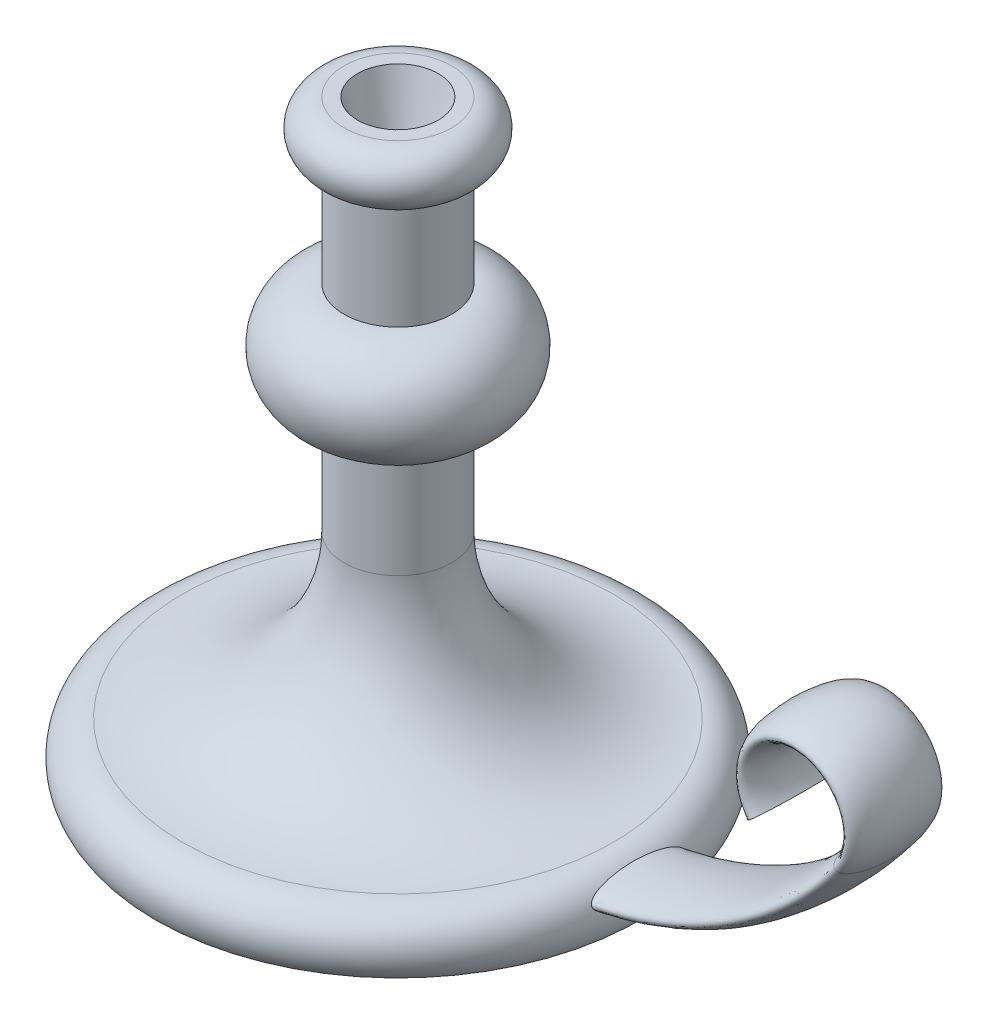
ISO-10303-21;
HEADER;
FILE_DESCRIPTION(('STEP AP214'),'2;1');
FILE_NAME('part.step','',(''),(''),'','','');
FILE_SCHEMA(('AUTOMOTIVE_DESIGN { 1 0 10303 214 1 1 1 1 }'));
ENDSEC;
DATA;
#1=APPLICATION_CONTEXT('core data for automotive mechanical design processes');
#2=APPLICATION_PROTOCOL_DEFINITION('international standard','automotive_design',2000,#1);
#3=PRODUCT_CONTEXT('',#1,'mechanical');
#4=PRODUCT('Part','Part','',(#3));
#5=PRODUCT_RELATED_PRODUCT_CATEGORY('part','',(#4));
#6=PRODUCT_DEFINITION_FORMATION('','',#4);
#7=PRODUCT_DEFINITION_CONTEXT('part definition',#1,'design');
#8=PRODUCT_DEFINITION('design','',#6,#7);
#9=PRODUCT_DEFINITION_SHAPE('','',#8);
#10=(LENGTH_UNIT() NAMED_UNIT(*) SI_UNIT(.MILLI.,.METRE.));
#11=(NAMED_UNIT(*) PLANE_ANGLE_UNIT() SI_UNIT($,.RADIAN.));
#12=(NAMED_UNIT(*) SI_UNIT($,.STERADIAN.) SOLID_ANGLE_UNIT());
#13=UNCERTAINTY_MEASURE_WITH_UNIT(LENGTH_MEASURE(1.E-05),#10,'distance_accuracy_value','');
#14=(GEOMETRIC_REPRESENTATION_CONTEXT(3) GLOBAL_UNCERTAINTY_ASSIGNED_CONTEXT((#13)) GLOBAL_UNIT_ASSIGNED_CONTEXT((#10,
#11,#12)) REPRESENTATION_CONTEXT('',''));
#15=CARTESIAN_POINT('',(0.,0.,0.));
#16=DIRECTION('',(0.,0.,1.));
#17=DIRECTION('',(1.,0.,0.));
#18=AXIS2_PLACEMENT_3D('',#15,#16,#17);
#19=CARTESIAN_POINT('',(90.,0.,0.));
#20=DIRECTION('',(0.,-1.,0.));
#21=DIRECTION('',(0.,0.,-1.));
#22=AXIS2_PLACEMENT_3D('',#19,#20,#21);
#23=PLANE('',#22);
#24=CARTESIAN_POINT('',(0.,0.,0.));
#25=DIRECTION('',(0.,-1.,0.));
#26=DIRECTION('',(0.,0.,-1.));
#27=AXIS2_PLACEMENT_3D('',#24,#25,#26);
#28=CIRCLE('',#27,90.);
#29=CARTESIAN_POINT('',(0.,0.,-90.));
#30=VERTEX_POINT('',#29);
#31=EDGE_CURVE('E62',#30,#30,#28,.T.);
#32=ORIENTED_EDGE('',*,*,#31,.T.);
#33=EDGE_LOOP('',(#32));
#34=FACE_BOUND('',#33,.T.);
#35=ADVANCED_FACE('F45',(#34),#23,.T.);
#36=CARTESIAN_POINT('',(0.,220.,0.));
#37=DIRECTION('',(0.,1.,0.));
#38=DIRECTION('',(0.,0.,1.));
#39=AXIS2_PLACEMENT_3D('',#36,#37,#38);
#40=PLANE('',#39);
#41=CARTESIAN_POINT('',(0.,220.,0.));
#42=DIRECTION('',(0.,1.,0.));
#43=DIRECTION('',(0.,0.,1.));
#44=AXIS2_PLACEMENT_3D('',#41,#42,#43);
#45=CIRCLE('',#44,15.);
#46=CARTESIAN_POINT('',(0.,220.,15.));
#47=VERTEX_POINT('',#46);
#48=EDGE_CURVE('E157',#47,#47,#45,.T.);
#49=ORIENTED_EDGE('',*,*,#48,.F.);
#50=EDGE_LOOP('',(#49));
#51=FACE_BOUND('',#50,.T.);
#52=CARTESIAN_POINT('',(0.,220.,0.));
#53=DIRECTION('',(0.,-1.,0.));
#54=DIRECTION('',(0.,0.,-1.));
#55=AXIS2_PLACEMENT_3D('',#52,#53,#54);
#56=CIRCLE('',#55,20.);
#57=CARTESIAN_POINT('',(0.,220.,-20.));
#58=VERTEX_POINT('',#57);
#59=EDGE_CURVE('E55',#58,#58,#56,.T.);
#60=ORIENTED_EDGE('',*,*,#59,.F.);
#61=EDGE_LOOP('',(#60));
#62=FACE_BOUND('',#61,.T.);
#63=ADVANCED_FACE('F92',(#51,#62),#40,.T.);
#64=CARTESIAN_POINT('',(0.,210.,0.));
#65=DIRECTION('',(0.,-1.,0.));
#66=DIRECTION('',(0.,0.,-1.));
#67=AXIS2_PLACEMENT_3D('',#64,#65,#66);
#68=TOROIDAL_SURFACE('',#67,20.,10.);
#69=ORIENTED_EDGE('',*,*,#59,.T.);
#70=EDGE_LOOP('',(#69));
#71=FACE_BOUND('',#70,.T.);
#72=CARTESIAN_POINT('',(0.,200.,0.));
#73=DIRECTION('',(0.,-1.,0.));
#74=DIRECTION('',(0.,0.,-1.));
#75=AXIS2_PLACEMENT_3D('',#72,#73,#74);
#76=CIRCLE('',#75,20.);
#77=CARTESIAN_POINT('',(0.,200.,-20.));
#78=VERTEX_POINT('',#77);
#79=EDGE_CURVE('E84',#78,#78,#76,.T.);
#80=ORIENTED_EDGE('',*,*,#79,.F.);
#81=EDGE_LOOP('',(#80));
#82=FACE_BOUND('',#81,.T.);
#83=ADVANCED_FACE('F89',(#71,#82),#68,.T.);
#84=CARTESIAN_POINT('',(0.,0.,0.));
#85=DIRECTION('',(0.,-1.,0.));
#86=DIRECTION('',(0.,0.,-1.));
#87=AXIS2_PLACEMENT_3D('',#84,#85,#86);
#88=CYLINDRICAL_SURFACE('',#87,20.);
#89=ORIENTED_EDGE('',*,*,#79,.T.);
#90=EDGE_LOOP('',(#89));
#91=FACE_BOUND('',#90,.T.);
#92=CARTESIAN_POINT('',(0.,160.,0.));
#93=DIRECTION('',(0.,-1.,0.));
#94=DIRECTION('',(0.,0.,-1.));
#95=AXIS2_PLACEMENT_3D('',#92,#93,#94);
#96=CIRCLE('',#95,20.);
#97=CARTESIAN_POINT('',(0.,160.,-20.));
#98=VERTEX_POINT('',#97);
#99=EDGE_CURVE('E81',#98,#98,#96,.T.);
#100=ORIENTED_EDGE('',*,*,#99,.F.);
#101=EDGE_LOOP('',(#100));
#102=FACE_BOUND('',#101,.T.);
#103=ADVANCED_FACE('F99',(#91,#102),#88,.T.);
#104=CARTESIAN_POINT('',(0.,140.,0.));
#105=DIRECTION('',(0.,-1.,0.));
#106=DIRECTION('',(0.,0.,-1.));
#107=AXIS2_PLACEMENT_3D('',#104,#105,#106);
#108=TOROIDAL_SURFACE('',#107,20.,20.);
#109=ORIENTED_EDGE('',*,*,#99,.T.);
#110=EDGE_LOOP('',(#109));
#111=FACE_BOUND('',#110,.T.);
#112=CARTESIAN_POINT('',(0.,120.,0.));
#113=DIRECTION('',(0.,-1.,0.));
#114=DIRECTION('',(0.,0.,-1.));
#115=AXIS2_PLACEMENT_3D('',#112,#113,#114);
#116=CIRCLE('',#115,20.);
#117=CARTESIAN_POINT('',(0.,120.,-20.));
#118=VERTEX_POINT('',#117);
#119=EDGE_CURVE('E78',#118,#118,#116,.T.);
#120=ORIENTED_EDGE('',*,*,#119,.F.);
#121=EDGE_LOOP('',(#120));
#122=FACE_BOUND('',#121,.T.);
#123=ADVANCED_FACE('F106',(#111,#122),#108,.T.);
#124=CARTESIAN_POINT('',(0.,0.,0.));
#125=DIRECTION('',(0.,-1.,0.));
#126=DIRECTION('',(0.,0.,-1.));
#127=AXIS2_PLACEMENT_3D('',#124,#125,#126);
#128=CYLINDRICAL_SURFACE('',#127,20.);
#129=ORIENTED_EDGE('',*,*,#119,.T.);
#130=EDGE_LOOP('',(#129));
#131=FACE_BOUND('',#130,.T.);
#132=CARTESIAN_POINT('',(0.,80.,0.));
#133=DIRECTION('',(0.,-1.,0.));
#134=DIRECTION('',(0.,0.,-1.));
#135=AXIS2_PLACEMENT_3D('',#132,#133,#134);
#136=CIRCLE('',#135,20.);
#137=CARTESIAN_POINT('',(0.,80.,-20.));
#138=VERTEX_POINT('',#137);
#139=EDGE_CURVE('E75',#138,#138,#136,.T.);
#140=ORIENTED_EDGE('',*,*,#139,.F.);
#141=EDGE_LOOP('',(#140));
#142=FACE_BOUND('',#141,.T.);
#143=ADVANCED_FACE('F110',(#131,#142),#128,.T.);
#144=CARTESIAN_POINT('',(0.,80.,0.));
#145=DIRECTION('',(0.,-1.,0.));
#146=DIRECTION('',(0.,0.,-1.));
#147=AXIS2_PLACEMENT_3D('',#144,#145,#146);
#148=TOROIDAL_SURFACE('',#147,80.,60.);
#149=ORIENTED_EDGE('',*,*,#139,.T.);
#150=EDGE_LOOP('',(#149));
#151=FACE_BOUND('',#150,.T.);
#152=CARTESIAN_POINT('',(0.,20.,0.));
#153=DIRECTION('',(0.,-1.,0.));
#154=DIRECTION('',(0.,0.,-1.));
#155=AXIS2_PLACEMENT_3D('',#152,#153,#154);
#156=CIRCLE('',#155,80.);
#157=CARTESIAN_POINT('',(0.,20.,-80.));
#158=VERTEX_POINT('',#157);
#159=EDGE_CURVE('E66',#158,#158,#156,.T.);
#160=ORIENTED_EDGE('',*,*,#159,.F.);
#161=EDGE_LOOP('',(#160));
#162=FACE_BOUND('',#161,.T.);
#163=ADVANCED_FACE('F114',(#151,#162),#148,.F.);
#164=CARTESIAN_POINT('',(0.,7.50000000000002,0.));
#165=DIRECTION('',(0.,-1.,0.));
#166=DIRECTION('',(0.,0.,-1.));
#167=AXIS2_PLACEMENT_3D('',#164,#165,#166);
#168=TOROIDAL_SURFACE('',#167,80.,12.5);
#169=CARTESIAN_POINT('',(89.5597422043342,12.9414346567555,-17.5));
#170=CARTESIAN_POINT('',(89.5390618403562,12.9834100865229,-17.4999996776707));
#171=CARTESIAN_POINT('',(89.518481763466,13.0254349004937,-17.4978446678338));
#172=CARTESIAN_POINT('',(89.4776811982744,13.1092324497794,-17.4892861575812));
#173=CARTESIAN_POINT('',(89.4574608430711,13.151005088161,-17.482881116885));
#174=CARTESIAN_POINT('',(89.397540281121,13.2754779151414,-17.4575154450277));
#175=CARTESIAN_POINT('',(89.3585808220613,13.357332519418,-17.4324042670615));
#176=CARTESIAN_POINT('',(89.2734407804368,13.5379179993389,-17.3597430943198));
#177=CARTESIAN_POINT('',(89.2281116968574,13.6353152430682,-17.3079906529225));
#178=CARTESIAN_POINT('',(89.142156713761,13.8217570109409,-17.1881654215548));
#179=CARTESIAN_POINT('',(89.10154096816,13.9107834263932,-17.1200583326704));
#180=CARTESIAN_POINT('',(89.0298799325305,14.0690063055582,-16.9825317839868));
#181=CARTESIAN_POINT('',(88.9982856031081,14.1392491335226,-16.9145677994464));
#182=CARTESIAN_POINT('',(88.9378435588022,14.2742914925202,-16.7722502997376));
#183=CARTESIAN_POINT('',(88.9089980734782,14.3390866000317,-16.6978916893925));
#184=CARTESIAN_POINT('',(88.8536099995594,14.4639626152392,-16.5442177801531));
#185=CARTESIAN_POINT('',(88.8270733532937,14.5240313225779,-16.4648905452804));
#186=CARTESIAN_POINT('',(88.7760376587064,14.6398576639347,-16.3025863942461));
#187=CARTESIAN_POINT('',(88.7515379613228,14.6956166708123,-16.2196106536441));
#188=CARTESIAN_POINT('',(88.704732820549,14.8023169553036,-16.0524273627841));
#189=CARTESIAN_POINT('',(88.6823939519366,14.8533308765832,-15.9682752160746));
#190=CARTESIAN_POINT('',(88.639155365759,14.9521540950118,-15.797741621076));
#191=CARTESIAN_POINT('',(88.6182558899722,14.9999628537458,-15.7113598015971));
#192=CARTESIAN_POINT('',(88.5573681790009,15.1392585624723,-15.4492483073626));
#193=CARTESIAN_POINT('',(88.5192579811328,15.2264609786254,-15.2707999543233));
#194=CARTESIAN_POINT('',(88.4468979005837,15.391673127629,-14.9088289385945));
#195=CARTESIAN_POINT('',(88.4126513155027,15.4696750103546,-14.7253021052892));
#196=CARTESIAN_POINT('',(88.347139159504,15.6182965032922,-14.3538259785737));
#197=CARTESIAN_POINT('',(88.3158872528146,15.6888824046965,-14.1658608782528));
#198=CARTESIAN_POINT('',(88.2560127035517,15.823379251243,-13.7874003918541));
#199=CARTESIAN_POINT('',(88.2273872233003,15.8872974109117,-13.5969079973404));
#200=CARTESIAN_POINT('',(88.1723348827449,16.0094159388248,-13.2138496737792));
#201=CARTESIAN_POINT('',(88.1459074726896,16.06761773743,-13.0212842768932));
#202=CARTESIAN_POINT('',(88.0884248304702,16.1932687928885,-12.5849658119249));
#203=CARTESIAN_POINT('',(88.0579162002184,16.2592725226906,-12.3407253521736));
#204=CARTESIAN_POINT('',(87.9994625659014,16.3844358500305,-11.8501803460784));
#205=CARTESIAN_POINT('',(87.9715178234089,16.4435947494061,-11.6038755919225));
#206=CARTESIAN_POINT('',(87.9178897421858,16.5558889779775,-11.1095299870482));
#207=CARTESIAN_POINT('',(87.8922075114269,16.6090213595567,-10.8614883492402));
#208=CARTESIAN_POINT('',(87.8429155378604,16.7098546386225,-10.364094360702));
#209=CARTESIAN_POINT('',(87.8193058942812,16.7575552760878,-10.1147419478214));
#210=CARTESIAN_POINT('',(87.7514718906048,16.8930622945827,-9.36631396644934));
#211=CARTESIAN_POINT('',(87.7101114199141,16.9735461668199,-8.86564202060351));
#212=CARTESIAN_POINT('',(87.6344118706354,17.1178657179368,-7.8615355184027));
#213=CARTESIAN_POINT('',(87.6000713341081,17.1817048544489,-7.35810155802608));
#214=CARTESIAN_POINT('',(87.5383679228555,17.2943697092707,-6.3522513611192));
#215=CARTESIAN_POINT('',(87.5109639050819,17.3432843238913,-5.84984753787602));
#216=CARTESIAN_POINT('',(87.4628391630612,17.4279603163538,-4.84354228831056));
#217=CARTESIAN_POINT('',(87.4421195253373,17.4637195559666,-4.33964063194135));
#218=CARTESIAN_POINT('',(87.4074386787955,17.5229738360404,-3.33084363886059));
#219=CARTESIAN_POINT('',(87.3934780874882,17.5464677559495,-2.82594821558726));
#220=CARTESIAN_POINT('',(87.3724154174236,17.5817273168609,-1.81615213380848));
#221=CARTESIAN_POINT('',(87.3653059747339,17.5935055508652,-1.31125206554565));
#222=CARTESIAN_POINT('',(87.3579750479625,17.6056484066489,-0.301318309133347));
#223=CARTESIAN_POINT('',(87.3577528582351,17.6060141977103,0.203715360025655));
#224=CARTESIAN_POINT('',(87.3641963426439,17.5953454261039,1.21356726554126));
#225=CARTESIAN_POINT('',(87.3708612610896,17.5843121142069,1.71838551945466));
#226=CARTESIAN_POINT('',(87.3886163883338,17.554616306541,2.60695068649809));
#227=CARTESIAN_POINT('',(87.3982690399213,17.5384060734754,2.99081046478796));
#228=CARTESIAN_POINT('',(87.421496688066,17.4990063104014,3.75807002785667));
#229=CARTESIAN_POINT('',(87.435071823598,17.4758165331044,4.14146979585383));
#230=CARTESIAN_POINT('',(87.4661109016121,17.4221255760208,4.90767543763164));
#231=CARTESIAN_POINT('',(87.4835755913649,17.3916229911935,5.29048118303713));
#232=CARTESIAN_POINT('',(87.52247652696,17.3226675403928,6.0572876660799));
#233=CARTESIAN_POINT('',(87.5439339089184,17.2841722314847,6.44128353835395));
#234=CARTESIAN_POINT('',(87.5907685418077,17.1987228636429,7.20803081067509));
#235=CARTESIAN_POINT('',(87.6161451191906,17.1517702579397,7.59078241304182));
#236=CARTESIAN_POINT('',(87.6708875244928,17.0486132676473,8.35453102594066));
#237=CARTESIAN_POINT('',(87.7002509792864,16.992414382578,8.73552894189086));
#238=CARTESIAN_POINT('',(87.7555693385741,16.8844873931685,9.40362807317296));
#239=CARTESIAN_POINT('',(87.780631862629,16.8349635590469,9.69115955865511));
#240=CARTESIAN_POINT('',(87.8333287645207,16.7293167465829,10.2648242071218));
#241=CARTESIAN_POINT('',(87.8609635304672,16.6731927720485,10.5509571522117));
#242=CARTESIAN_POINT('',(87.9190678138249,16.5534902310352,11.1217112831607));
#243=CARTESIAN_POINT('',(87.9495404231884,16.4899035134827,11.4063304543319));
#244=CARTESIAN_POINT('',(88.0137266324375,16.3541216812728,11.9738772339471));
#245=CARTESIAN_POINT('',(88.0474477220507,16.2819065762203,12.2567992545893));
#246=CARTESIAN_POINT('',(88.1183718381953,16.1280994435205,12.8175821097583));
#247=CARTESIAN_POINT('',(88.1555499028382,16.0465737963572,13.0954641920677));
#248=CARTESIAN_POINT('',(88.2343580118384,15.8719007074315,13.6468218234682));
#249=CARTESIAN_POINT('',(88.2759857295858,15.7787593350287,13.9202995902177));
#250=CARTESIAN_POINT('',(88.3426568223938,15.6283840406492,14.3254052817086));
#251=CARTESIAN_POINT('',(88.3655500017784,15.5765627213434,14.4594023169275));
#252=CARTESIAN_POINT('',(88.4129882653632,15.4688611687537,14.725452565537));
#253=CARTESIAN_POINT('',(88.437533168995,15.4129813790938,14.8575059894882));
#254=CARTESIAN_POINT('',(88.4884967907571,15.2967269720353,15.1188747284338));
#255=CARTESIAN_POINT('',(88.5149109123158,15.2363633637368,15.2481958098574));
#256=CARTESIAN_POINT('',(88.570024175177,15.1103179001214,15.5037035642076));
#257=CARTESIAN_POINT('',(88.5987227483176,15.0446373670991,15.6298910063168));
#258=CARTESIAN_POINT('',(88.6570151826477,14.9113179601612,15.8704199707054));
#259=CARTESIAN_POINT('',(88.6864417367859,14.8440563407292,15.9850095995256));
#260=CARTESIAN_POINT('',(88.7482816567767,14.7030103830829,16.2094581395948));
#261=CARTESIAN_POINT('',(88.780697475614,14.6292206899984,16.3193130551165));
#262=CARTESIAN_POINT('',(88.8489097184971,14.4745639616534,16.531514662662));
#263=CARTESIAN_POINT('',(88.8846785573507,14.3937550191614,16.6339121024913));
#264=CARTESIAN_POINT('',(88.9606113704152,14.2232561160769,16.8291907541919));
#265=CARTESIAN_POINT('',(89.0007675950252,14.1335818404868,16.922088201658));
#266=CARTESIAN_POINT('',(89.0601235459872,14.0021924630807,17.0411637727682));
#267=CARTESIAN_POINT('',(89.0770574086404,13.964825033993,17.0732949178268));
#268=CARTESIAN_POINT('',(89.1117704043088,13.8885105828125,17.1351129203986));
#269=CARTESIAN_POINT('',(89.1295494801997,13.8495636674964,17.16479994273));
#270=CARTESIAN_POINT('',(89.1842722230346,13.73018653242,17.2496672583029));
#271=CARTESIAN_POINT('',(89.2225929343975,13.647238737129,17.3006362954165));
#272=CARTESIAN_POINT('',(89.2830198855203,13.5177923286579,17.3659392171783));
#273=CARTESIAN_POINT('',(89.3038035106324,13.4734899832394,17.3859446551269));
#274=CARTESIAN_POINT('',(89.3462357272129,13.3835498526414,17.421521231844));
#275=CARTESIAN_POINT('',(89.3678838017235,13.337912869846,17.4370949768747));
#276=CARTESIAN_POINT('',(89.4119048024239,13.245671484545,17.4633118273198));
#277=CARTESIAN_POINT('',(89.4342765183815,13.1990687398026,17.4739627514632));
#278=CARTESIAN_POINT('',(89.4796070415905,13.1052444737539,17.490000362864));
#279=CARTESIAN_POINT('',(89.5025657624808,13.0580230439625,17.495387819971));
#280=CARTESIAN_POINT('',(89.5464271716018,12.9684112208448,17.5004320668286));
#281=CARTESIAN_POINT('',(89.5672934245651,12.9260327119428,17.5006298436875));
#282=CARTESIAN_POINT('',(89.6091580078855,12.8415284156485,17.496667300483));
#283=CARTESIAN_POINT('',(89.6301563797467,12.7994027167223,17.4925055351934));
#284=CARTESIAN_POINT('',(89.672115635143,12.715749619811,17.4799650825831));
#285=CARTESIAN_POINT('',(89.6930765014328,12.674222454879,17.4715847960014));
#286=CARTESIAN_POINT('',(89.7348115258833,12.592053251624,17.4508625220261));
#287=CARTESIAN_POINT('',(89.755585576578,12.551411705739,17.438518387727));
#288=CARTESIAN_POINT('',(89.8013847331776,12.4623676182579,17.407062698976));
#289=CARTESIAN_POINT('',(89.8263321178973,12.414240205708,17.3870577635769));
#290=CARTESIAN_POINT('',(89.8756026524762,12.3198942829531,17.3423007335128));
#291=CARTESIAN_POINT('',(89.8999253272691,12.2736772101065,17.3175451406781));
#292=CARTESIAN_POINT('',(89.9718636752114,12.137971956704,17.2371059859826));
#293=CARTESIAN_POINT('',(90.0184026508767,12.0515209207992,17.1752845379974));
#294=CARTESIAN_POINT('',(90.1015176697337,11.8991704299989,17.0502729237446));
#295=CARTESIAN_POINT('',(90.1385373685484,11.8321383297492,16.9886971231216));
#296=CARTESIAN_POINT('',(90.2104869329278,11.7032426034954,16.8591573255865));
#297=CARTESIAN_POINT('',(90.2454151408798,11.6413830620092,16.791188368637));
#298=CARTESIAN_POINT('',(90.3133841124364,11.5222099067345,16.6502911436161));
#299=CARTESIAN_POINT('',(90.3464212107123,11.4649050425003,16.5773538074554));
#300=CARTESIAN_POINT('',(90.4107258034173,11.3544143267815,16.4277349965844));
#301=CARTESIAN_POINT('',(90.4419937497578,11.3012274221165,16.3510544874362));
#302=CARTESIAN_POINT('',(90.5066142435686,11.1922810586099,16.1853189525374));
#303=CARTESIAN_POINT('',(90.5397652495637,11.1369814833089,16.0958847835336));
#304=CARTESIAN_POINT('',(90.604304294124,11.030319462156,15.9140859303211));
#305=CARTESIAN_POINT('',(90.6356921559874,10.9789574107343,15.8217209538341));
#306=CARTESIAN_POINT('',(90.6968383877969,10.8797698841654,15.634797499442));
#307=CARTESIAN_POINT('',(90.7265992701634,10.8319389137701,15.5402427441427));
#308=CARTESIAN_POINT('',(90.7846969346249,10.7393295137684,15.3492353522613));
#309=CARTESIAN_POINT('',(90.8130337948201,10.694550916707,15.2527828201671));
#310=CARTESIAN_POINT('',(90.8771212205236,10.5940589597553,15.0277319837691));
#311=CARTESIAN_POINT('',(90.9124022819655,10.5393328792869,14.898559344015));
#312=CARTESIAN_POINT('',(90.9809741103799,10.4339610325188,14.6380328432619));
#313=CARTESIAN_POINT('',(91.01426459514,10.3833158444321,14.5066786763357));
#314=CARTESIAN_POINT('',(91.111517191821,10.2366440116081,14.1096810918792));
#315=CARTESIAN_POINT('',(91.1727828792963,10.1460018602119,13.8413800425931));
#316=CARTESIAN_POINT('',(91.2892862812457,9.97615455726958,13.2997906638473));
#317=CARTESIAN_POINT('',(91.3445203789084,9.89695625887082,13.0264994554551));
#318=CARTESIAN_POINT('',(91.4499805719977,9.74769654866312,12.4748594155965));
#319=CARTESIAN_POINT('',(91.5001780442569,9.67768673078065,12.1964912536716));
#320=CARTESIAN_POINT('',(91.5957501918064,9.54592534416435,11.6372393425764));
#321=CARTESIAN_POINT('',(91.641128572379,9.48416742117678,11.3563577087927));
#322=CARTESIAN_POINT('',(91.727513261696,9.36779787162597,10.7925089006699));
#323=CARTESIAN_POINT('',(91.7685202729417,9.31318509647972,10.5095420692706));
#324=CARTESIAN_POINT('',(91.8503345045433,9.20520508711854,9.91387150213853));
#325=CARTESIAN_POINT('',(91.8907217744485,9.15249390095859,9.60099168323839));
#326=CARTESIAN_POINT('',(91.9669218199105,9.05389158705577,8.97359688182186));
#327=CARTESIAN_POINT('',(92.0027343661627,9.00800080116182,8.65908181816167));
#328=CARTESIAN_POINT('',(92.0700329889397,8.92240020575349,8.02865568809014));
#329=CARTESIAN_POINT('',(92.1015177516246,8.88269227276236,7.71274422766735));
#330=CARTESIAN_POINT('',(92.16033258385,8.80898713679344,7.07986626810865));
#331=CARTESIAN_POINT('',(92.1876625005416,8.77499014390536,6.76289973059659));
#332=CARTESIAN_POINT('',(92.2635030013647,8.68114273902129,5.81249868362513));
#333=CARTESIAN_POINT('',(92.306051744855,8.6291999949222,5.1777874719415));
#334=CARTESIAN_POINT('',(92.3760091017523,8.54431318450714,3.90627938187153));
#335=CARTESIAN_POINT('',(92.4034169750227,8.51137004695209,3.26948240305628));
#336=CARTESIAN_POINT('',(92.4435085691827,8.46331702284134,1.99545741778809));
#337=CARTESIAN_POINT('',(92.4562084043365,8.44818761908857,1.35823064985796));
#338=CARTESIAN_POINT('',(92.4671302630246,8.43517103988555,0.0834423270855406));
#339=CARTESIAN_POINT('',(92.4653514271759,8.43728488791031,-0.554119245383205));
#340=CARTESIAN_POINT('',(92.4472853754494,8.45883344750911,-1.82886328296477));
#341=CARTESIAN_POINT('',(92.4309954438926,8.47827140120312,-2.46604565477578));
#342=CARTESIAN_POINT('',(92.3836590626412,8.53514174464766,-3.73902583866463));
#343=CARTESIAN_POINT('',(92.3526140808135,8.57257234445186,-4.37482378214951));
#344=CARTESIAN_POINT('',(92.2921790866407,8.64621329194953,-5.36625544460428));
#345=CARTESIAN_POINT('',(92.2680118235612,8.67578736963435,-5.72271555901329));
#346=CARTESIAN_POINT('',(92.2147013952359,8.74146404735341,-6.43465819602788));
#347=CARTESIAN_POINT('',(92.1855583836338,8.77756644580487,-6.79014074847482));
#348=CARTESIAN_POINT('',(92.1221127048898,8.85679311513296,-7.4998383605901));
#349=CARTESIAN_POINT('',(92.0878103957553,8.89991689880766,-7.85405350646006));
#350=CARTESIAN_POINT('',(92.0137981226255,8.9938414326959,-8.56089767223488));
#351=CARTESIAN_POINT('',(91.9740883343963,9.0446419333892,-8.91352674330925));
#352=CARTESIAN_POINT('',(91.9015818240068,9.13842562293654,-9.51226790232722));
#353=CARTESIAN_POINT('',(91.8702370654076,9.17924629619372,-9.75889575933819));
#354=CARTESIAN_POINT('',(91.8045624920062,9.26550036635848,-10.2509419620266));
#355=CARTESIAN_POINT('',(91.7702327567075,9.31093364041704,-10.4963603397341));
#356=CARTESIAN_POINT('',(91.6984266463276,9.40685898724815,-10.9855805665703));
#357=CARTESIAN_POINT('',(91.6609523533821,9.45734771681899,-11.2293833718135));
#358=CARTESIAN_POINT('',(91.5826038967897,9.56401317098959,-11.7151775621018));
#359=CARTESIAN_POINT('',(91.5417298772542,9.62018965451249,-11.9571690234546));
#360=CARTESIAN_POINT('',(91.4386423376752,9.76351210996318,-12.5384162018458));
#361=CARTESIAN_POINT('',(91.3745858903293,9.85386844470678,-12.8765786557747));
#362=CARTESIAN_POINT('',(91.2720163238271,10.00140155238,-13.3793136041289));
#363=CARTESIAN_POINT('',(91.2367090969997,10.0526332971687,-13.5462966134985));
#364=CARTESIAN_POINT('',(91.1637294936461,10.1596261841612,-13.8782853379535));
#365=CARTESIAN_POINT('',(91.1260572231726,10.2153871233012,-14.0432911413054));
#366=CARTESIAN_POINT('',(91.0448513754002,10.3369382727862,-14.384441669311));
#367=CARTESIAN_POINT('',(91.001090840792,10.4031767890591,-14.5603739146097));
#368=CARTESIAN_POINT('',(90.910044033165,10.5428509324191,-14.9085311659815));
#369=CARTESIAN_POINT('',(90.862756586535,10.6162889577857,-15.0807549132298));
#370=CARTESIAN_POINT('',(90.7642492199859,10.7715651970475,-15.4195496037289));
#371=CARTESIAN_POINT('',(90.7130423069871,10.8533759065562,-15.5861368065571));
#372=CARTESIAN_POINT('',(90.6058220172117,11.0275348916423,-15.9120386126937));
#373=CARTESIAN_POINT('',(90.5498128203456,11.1198740259074,-16.0713593593312));
#374=CARTESIAN_POINT('',(90.4444082893055,11.2969255920335,-16.3465910082031));
#375=CARTESIAN_POINT('',(90.3961277047708,11.3791055101418,-16.464544833618));
#376=CARTESIAN_POINT('',(90.2950977924851,11.553863348686,-16.6911566146543));
#377=CARTESIAN_POINT('',(90.2423390562534,11.6464633011947,-16.7997939840159));
#378=CARTESIAN_POINT('',(90.1590440243459,11.7953014200267,-16.952487089068));
#379=CARTESIAN_POINT('',(90.1303607600851,11.8469859215391,-17.0019977189775));
#380=CARTESIAN_POINT('',(90.0716181087378,11.9538274561504,-17.0963102611094));
#381=CARTESIAN_POINT('',(90.0415584049398,12.0089852895518,-17.1411110817335));
#382=CARTESIAN_POINT('',(89.9801756575599,12.1227246632084,-17.2246441347394));
#383=CARTESIAN_POINT('',(89.9488577537654,12.1812926416243,-17.2633984155369));
#384=CARTESIAN_POINT('',(89.8849549671332,12.3020144005056,-17.3335784406428));
#385=CARTESIAN_POINT('',(89.8523712452277,12.364164919465,-17.3650107233702));
#386=CARTESIAN_POINT('',(89.7981176909037,12.4687258013531,-17.4092508881813));
#387=CARTESIAN_POINT('',(89.7767436177658,12.5101841078541,-17.4246893204626));
#388=CARTESIAN_POINT('',(89.7336969050677,12.5942336377174,-17.4515182330192));
#389=CARTESIAN_POINT('',(89.7120243813914,12.6368244270176,-17.4629102408532));
#390=CARTESIAN_POINT('',(89.6685521390584,12.7228207531289,-17.4812886417918));
#391=CARTESIAN_POINT('',(89.6467526103347,12.7662252198268,-17.488280453409));
#392=CARTESIAN_POINT('',(89.6031794397247,12.8535466229687,-17.4976362320133));
#393=CARTESIAN_POINT('',(89.5814057970824,12.8974635440191,-17.5000003376542));
#394=CARTESIAN_POINT('',(89.5597422043342,12.9414346567555,-17.5));
#395=B_SPLINE_CURVE_WITH_KNOTS('',3,(#169,#170,#171,#172,#173,#174,#175,#176,#177,#178,#179,
#180,#181,#182,#183,#184,#185,#186,#187,#188,#189,#190,#191,#192,#193,#194,#195,#196,#197,#198,
#199,#200,#201,#202,#203,#204,#205,#206,#207,#208,#209,#210,#211,#212,#213,#214,#215,#216,#217,
#218,#219,#220,#221,#222,#223,#224,#225,#226,#227,#228,#229,#230,#231,#232,#233,#234,#235,#236,
#237,#238,#239,#240,#241,#242,#243,#244,#245,#246,#247,#248,#249,#250,#251,#252,#253,#254,#255,
#256,#257,#258,#259,#260,#261,#262,#263,#264,#265,#266,#267,#268,#269,#270,#271,#272,#273,#274,
#275,#276,#277,#278,#279,#280,#281,#282,#283,#284,#285,#286,#287,#288,#289,#290,#291,#292,#293,
#294,#295,#296,#297,#298,#299,#300,#301,#302,#303,#304,#305,#306,#307,#308,#309,#310,#311,#312,
#313,#314,#315,#316,#317,#318,#319,#320,#321,#322,#323,#324,#325,#326,#327,#328,#329,#330,#331,
#332,#333,#334,#335,#336,#337,#338,#339,#340,#341,#342,#343,#344,#345,#346,#347,#348,#349,#350,
#351,#352,#353,#354,#355,#356,#357,#358,#359,#360,#361,#362,#363,#364,#365,#366,#367,#368,#369,
#370,#371,#372,#373,#374,#375,#376,#377,#378,#379,#380,#381,#382,#383,#384,#385,#386,#387,#388,
#389,#390,#391,#392,#393,#394),.UNSPECIFIED.,.T.,.F.,(4,2,2,2,2,2,2,2,2,2,2,2,2,2,2,2,2,2,2,2,2,
2,2,2,2,2,2,2,2,2,2,2,2,2,2,2,2,2,2,2,2,2,2,2,2,2,2,2,2,2,2,2,2,2,2,2,2,2,2,2,2,2,2,2,2,2,2,2,2,
2,2,2,2,2,2,2,2,2,2,2,2,2,2,2,2,2,2,2,2,2,2,2,2,2,2,2,2,2,2,2,2,2,2,2,2,2,2,2,2,2,2,2,4),(0.,
0.140326879649338,0.28070464384434,0.561461806499993,0.917225717585847,1.27374235386088,
1.58146302398149,1.88943119593643,2.19816989275475,2.50680983170024,2.80944292372747,
3.11212672643252,3.71838915770187,4.32516518168237,4.93458970782531,5.54334784093522,
6.15195325906631,6.91631911029025,7.68076285707064,8.445578901447,9.21043154271101,
10.7363530227224,12.2619572680847,13.7782885580519,15.2948661984779,16.8115823682398,
18.3266664767781,19.8415953542032,21.3563580231465,22.5092504482304,23.6621837256804,
24.8153386988894,25.9747813799626,27.134025021935,28.292581642942,29.1710242088834,
30.0495995331109,30.9291435591537,31.8107663507029,32.6864555684202,33.561689129897,
33.9980703124472,34.4344038665397,34.8696994156041,35.3048870393024,35.7129485465608,
36.1213479397348,36.526641361958,36.9312301321626,37.0874810726008,37.2437214677035,
37.5562829439447,37.7147148343189,37.8730533580124,38.0311395270881,38.189202570574,
38.3307149014327,38.4722741597122,38.613887124224,38.755576919115,38.9286541005771,
39.1018592207179,39.4485901352337,39.7429975955383,40.0376353818188,40.3328261359403,
40.6279411430418,40.958547980893,41.2891878931723,41.6193018978009,41.9493977775682,
42.383255150859,42.8171738887959,43.6859467918754,44.5552378220685,45.4292182663343,
46.3025217875258,47.1756847521787,48.1351081860306,49.0945796914494,50.0543418354832,
51.0141392787902,52.9283366635976,54.8426276125046,56.754819256277,58.6671243992118,
60.5797874956815,62.4922603557644,63.56768193218,64.6430703071829,65.7183840945986,
66.7936629380587,67.5494303160568,68.3051775707159,69.0604283053747,69.8156470419327,
70.8826765887329,71.4172057561778,71.951710971531,72.530589486171,73.1096614946418,
73.6868888443979,74.2636187787,74.7180950553365,75.173551000908,75.4046853668793,
75.6358731855888,75.8661972266859,76.0963147970912,76.243555039853,76.39073963898,
76.5377426347988,76.6847412260987),.UNSPECIFIED.);
#396=CARTESIAN_POINT('',(89.5597422043342,12.9414346567555,-17.5));
#397=VERTEX_POINT('',#396);
#398=EDGE_CURVE('E13',#397,#397,#395,.T.);
#399=ORIENTED_EDGE('',*,*,#398,.F.);
#400=EDGE_LOOP('',(#399));
#401=FACE_BOUND('',#400,.T.);
#402=ORIENTED_EDGE('',*,*,#159,.T.);
#403=EDGE_LOOP('',(#402));
#404=FACE_BOUND('',#403,.T.);
#405=ORIENTED_EDGE('',*,*,#31,.F.);
#406=EDGE_LOOP('',(#405));
#407=FACE_BOUND('',#406,.T.);
#408=ADVANCED_FACE('F117',(#401,#404,#407),#168,.T.);
#409=CARTESIAN_POINT('',(148.,70.,0.));
#410=DIRECTION('',(0.6,-0.8,0.));
#411=DIRECTION('',(0.,0.,-1.));
#412=AXIS2_PLACEMENT_3D('',#409,#410,#411);
#413=PLANE('',#412);
#414=CARTESIAN_POINT('',(148.,70.,0.));
#415=DIRECTION('',(0.6,-0.8,0.));
#416=DIRECTION('',(0.,0.,-1.));
#417=AXIS2_PLACEMENT_3D('',#414,#415,#416);
#418=ELLIPSE('',#417,17.5,4.99999999999999);
#419=CARTESIAN_POINT('',(148.,70.,-17.5));
#420=VERTEX_POINT('',#419);
#421=EDGE_CURVE('E59',#420,#420,#418,.T.);
#422=ORIENTED_EDGE('',*,*,#421,.T.);
#423=EDGE_LOOP('',(#422));
#424=FACE_BOUND('',#423,.T.);
#425=ADVANCED_FACE('F60',(#424),#413,.T.);
#426=CARTESIAN_POINT('',(60.,10.,-17.5));
#427=CARTESIAN_POINT('',(108.107236977278,10.,-17.5));
#428=CARTESIAN_POINT('',(151.135657813633,31.5142104181772,-17.5));
#429=CARTESIAN_POINT('',(180.,70.,-17.5));
#430=CARTESIAN_POINT('',(60.,20.,-17.5));
#431=CARTESIAN_POINT('',(104.90008784546,20.,-17.5));
#432=CARTESIAN_POINT('',(145.059947292724,40.0799297236321,-17.5));
#433=CARTESIAN_POINT('',(172.,76.,-17.5));
#434=CARTESIAN_POINT('',(60.,20.,17.5));
#435=CARTESIAN_POINT('',(104.90008784546,20.,17.5));
#436=CARTESIAN_POINT('',(145.059947292724,40.0799297236321,17.5));
#437=CARTESIAN_POINT('',(172.,76.,17.5));
#438=CARTESIAN_POINT('',(60.,10.,17.5));
#439=CARTESIAN_POINT('',(108.107236977278,10.,17.5));
#440=CARTESIAN_POINT('',(151.135657813633,31.5142104181772,17.5));
#441=CARTESIAN_POINT('',(180.,70.,17.5));
#442=CARTESIAN_POINT('',(60.,0.,17.5));
#443=CARTESIAN_POINT('',(111.314386109097,0.,17.5));
#444=CARTESIAN_POINT('',(157.211368334542,22.9484911127224,17.5));
#445=CARTESIAN_POINT('',(188.,64.,17.5));
#446=CARTESIAN_POINT('',(60.,0.,-17.5));
#447=CARTESIAN_POINT('',(111.314386109097,0.,-17.5));
#448=CARTESIAN_POINT('',(157.211368334542,22.9484911127224,-17.5));
#449=CARTESIAN_POINT('',(188.,64.,-17.5));
#450=CARTESIAN_POINT('',(60.,10.,-17.5));
#451=CARTESIAN_POINT('',(108.107236977278,10.,-17.5));
#452=CARTESIAN_POINT('',(151.135657813633,31.5142104181772,-17.5));
#453=CARTESIAN_POINT('',(180.,70.,-17.5));
#454=(BOUNDED_SURFACE() B_SPLINE_SURFACE(3,3,((#426,#427,#428,#429),(#430,#431,#432,#433),(#434,
#435,#436,#437),(#438,#439,#440,#441),(#442,#443,#444,#445),(#446,#447,#448,#449),(#450,#451,
#452,#453)),.UNSPECIFIED.,.T.,.F.,.F.) B_SPLINE_SURFACE_WITH_KNOTS((4,3,4),(4,4),(0.,0.5,1.),
(0.,1.),.UNSPECIFIED.) GEOMETRIC_REPRESENTATION_ITEM() RATIONAL_B_SPLINE_SURFACE(((1.,
0.929618127333277,0.929618127333277,1.),(0.333333333333333,0.309872709111092,0.309872709111092,
0.333333333333333),(0.333333333333333,0.309872709111092,0.309872709111092,0.333333333333333),
(1.,0.929618127333277,0.929618127333277,1.),(0.333333333333333,0.309872709111092,
0.309872709111092,0.333333333333333),(0.333333333333333,0.309872709111092,0.309872709111092,
0.333333333333333),(1.,0.929618127333277,0.929618127333277,1.))) REPRESENTATION_ITEM('') SURFACE());
#455=CARTESIAN_POINT('',(180.,70.,0.));
#456=DIRECTION('',(0.6,0.8,0.));
#457=DIRECTION('',(0.,0.,-1.));
#458=AXIS2_PLACEMENT_3D('',#455,#456,#457);
#459=ELLIPSE('',#458,17.5,4.99999999999999);
#460=CARTESIAN_POINT('',(180.,70.,-17.5));
#461=VERTEX_POINT('',#460);
#462=EDGE_CURVE('E63',#461,#461,#459,.T.);
#463=ORIENTED_EDGE('',*,*,#398,.T.);
#464=EDGE_LOOP('',(#463));
#465=FACE_BOUND('',#464,.T.);
#466=ORIENTED_EDGE('',*,*,#462,.F.);
#467=EDGE_LOOP('',(#466));
#468=FACE_BOUND('',#467,.T.);
#469=ADVANCED_FACE('F126',(#465,#468),#454,.T.);
#470=CARTESIAN_POINT('',(180.,70.,-17.5));
#471=CARTESIAN_POINT('',(191.33126291999,85.1083505599865,-17.5));
#472=CARTESIAN_POINT('',(182.885438199983,102.,-17.5));
#473=CARTESIAN_POINT('',(164.,102.,-17.5));
#474=CARTESIAN_POINT('',(145.114561800017,102.,-17.5));
#475=CARTESIAN_POINT('',(136.66873708001,85.1083505599866,-17.5));
#476=CARTESIAN_POINT('',(148.,70.0000000000001,-17.5));
#477=CARTESIAN_POINT('',(172.,76.,-17.5));
#478=CARTESIAN_POINT('',(177.665631459995,83.5541752799933,-17.5));
#479=CARTESIAN_POINT('',(173.442719099992,92.,-17.5));
#480=CARTESIAN_POINT('',(164.,92.,-17.5));
#481=CARTESIAN_POINT('',(154.557280900008,92.0000000000001,-17.5));
#482=CARTESIAN_POINT('',(150.334368540005,83.5541752799933,-17.5));
#483=CARTESIAN_POINT('',(156.,76.0000000000001,-17.5));
#484=CARTESIAN_POINT('',(172.,76.,17.5));
#485=CARTESIAN_POINT('',(177.665631459995,83.5541752799933,17.5));
#486=CARTESIAN_POINT('',(173.442719099992,92.,17.5));
#487=CARTESIAN_POINT('',(164.,92.,17.5));
#488=CARTESIAN_POINT('',(154.557280900008,92.0000000000001,17.5));
#489=CARTESIAN_POINT('',(150.334368540005,83.5541752799933,17.5));
#490=CARTESIAN_POINT('',(156.,76.0000000000001,17.5));
#491=CARTESIAN_POINT('',(180.,70.,17.5));
#492=CARTESIAN_POINT('',(191.33126291999,85.1083505599865,17.5));
#493=CARTESIAN_POINT('',(182.885438199983,102.,17.5));
#494=CARTESIAN_POINT('',(164.,102.,17.5));
#495=CARTESIAN_POINT('',(145.114561800017,102.,17.5));
#496=CARTESIAN_POINT('',(136.66873708001,85.1083505599866,17.5));
#497=CARTESIAN_POINT('',(148.,70.0000000000001,17.5));
#498=CARTESIAN_POINT('',(188.,64.,17.5));
#499=CARTESIAN_POINT('',(204.996894379985,86.6625258399798,17.5));
#500=CARTESIAN_POINT('',(192.328157299975,112.,17.5));
#501=CARTESIAN_POINT('',(164.,112.,17.5));
#502=CARTESIAN_POINT('',(135.671842700025,112.,17.5));
#503=CARTESIAN_POINT('',(123.003105620015,86.6625258399798,17.5));
#504=CARTESIAN_POINT('',(140.,64.,17.5));
#505=CARTESIAN_POINT('',(188.,64.,-17.5));
#506=CARTESIAN_POINT('',(204.996894379985,86.6625258399798,-17.5));
#507=CARTESIAN_POINT('',(192.328157299975,112.,-17.5));
#508=CARTESIAN_POINT('',(164.,112.,-17.5));
#509=CARTESIAN_POINT('',(135.671842700025,112.,-17.5));
#510=CARTESIAN_POINT('',(123.003105620015,86.6625258399798,-17.5));
#511=CARTESIAN_POINT('',(140.,64.,-17.5));
#512=CARTESIAN_POINT('',(180.,70.,-17.5));
#513=CARTESIAN_POINT('',(191.33126291999,85.1083505599865,-17.5));
#514=CARTESIAN_POINT('',(182.885438199983,102.,-17.5));
#515=CARTESIAN_POINT('',(164.,102.,-17.5));
#516=CARTESIAN_POINT('',(145.114561800017,102.,-17.5));
#517=CARTESIAN_POINT('',(136.66873708001,85.1083505599866,-17.5));
#518=CARTESIAN_POINT('',(148.,70.0000000000001,-17.5));
#519=(BOUNDED_SURFACE() B_SPLINE_SURFACE(3,3,((#470,#471,#472,#473,#474,#475,#476),(#477,#478,
#479,#480,#481,#482,#483),(#484,#485,#486,#487,#488,#489,#490),(#491,#492,#493,#494,#495,#496,
#497),(#498,#499,#500,#501,#502,#503,#504),(#505,#506,#507,#508,#509,#510,#511),(#512,#513,#514,
#515,#516,#517,#518)),.UNSPECIFIED.,.T.,.F.,.F.) B_SPLINE_SURFACE_WITH_KNOTS((4,3,4),(4,3,4),
(0.,0.5,1.),(0.,0.5,1.),
.UNSPECIFIED.) GEOMETRIC_REPRESENTATION_ITEM() RATIONAL_B_SPLINE_SURFACE(((1.,0.631475730333305,
0.631475730333305,1.,0.631475730333305,0.631475730333305,1.),(0.333333333333333,
0.210491910111102,0.210491910111102,0.333333333333333,0.210491910111102,0.210491910111102,
0.333333333333333),(0.333333333333333,0.210491910111102,0.210491910111102,0.333333333333333,
0.210491910111102,0.210491910111102,0.333333333333333),(1.,0.631475730333305,0.631475730333305,
1.,0.631475730333305,0.631475730333305,1.),(0.333333333333333,0.210491910111102,
0.210491910111102,0.333333333333333,0.210491910111102,0.210491910111102,0.333333333333333),
(0.333333333333333,0.210491910111102,0.210491910111102,0.333333333333333,0.210491910111102,
0.210491910111102,0.333333333333333),(1.,0.631475730333305,0.631475730333305,1.,
0.631475730333305,0.631475730333305,1.))) REPRESENTATION_ITEM('') SURFACE());
#520=ORIENTED_EDGE('',*,*,#421,.F.);
#521=EDGE_LOOP('',(#520));
#522=FACE_BOUND('',#521,.T.);
#523=ORIENTED_EDGE('',*,*,#462,.T.);
#524=EDGE_LOOP('',(#523));
#525=FACE_BOUND('',#524,.T.);
#526=ADVANCED_FACE('F123',(#522,#525),#519,.T.);
#527=CARTESIAN_POINT('',(0.,220.,0.));
#528=DIRECTION('',(0.,1.,0.));
#529=DIRECTION('',(0.,0.,1.));
#530=AXIS2_PLACEMENT_3D('',#527,#528,#529);
#531=CONICAL_SURFACE('',#530,15.,0.26179938779915);
#532=CARTESIAN_POINT('',(0.,195.,0.));
#533=DIRECTION('',(0.,1.,0.));
#534=DIRECTION('',(0.,0.,1.));
#535=AXIS2_PLACEMENT_3D('',#532,#533,#534);
#536=CIRCLE('',#535,8.30127018922192);
#537=CARTESIAN_POINT('',(0.,195.,8.30127018922192));
#538=VERTEX_POINT('',#537);
#539=EDGE_CURVE('E69',#538,#538,#536,.T.);
#540=ORIENTED_EDGE('',*,*,#539,.F.);
#541=EDGE_LOOP('',(#540));
#542=FACE_BOUND('',#541,.T.);
#543=ORIENTED_EDGE('',*,*,#48,.T.);
#544=EDGE_LOOP('',(#543));
#545=FACE_BOUND('',#544,.T.);
#546=ADVANCED_FACE('F127',(#542,#545),#531,.F.);
#547=CARTESIAN_POINT('',(0.,195.,0.));
#548=DIRECTION('',(0.,1.,0.));
#549=DIRECTION('',(0.,0.,1.));
#550=AXIS2_PLACEMENT_3D('',#547,#548,#549);
#551=PLANE('',#550);
#552=ORIENTED_EDGE('',*,*,#539,.T.);
#553=EDGE_LOOP('',(#552));
#554=FACE_BOUND('',#553,.T.);
#555=ADVANCED_FACE('F149',(#554),#551,.T.);
#556=CLOSED_SHELL('',(#35,#63,#83,#103,#123,#143,#163,#408,#425,#469,#526,#546,#555));
#557=MANIFOLD_SOLID_BREP('B2',#556);
#558=ADVANCED_BREP_SHAPE_REPRESENTATION('',(#18,#557),#14);
#559=SHAPE_DEFINITION_REPRESENTATION(#9,#558);
ENDSEC;
END-ISO-10303-21;
